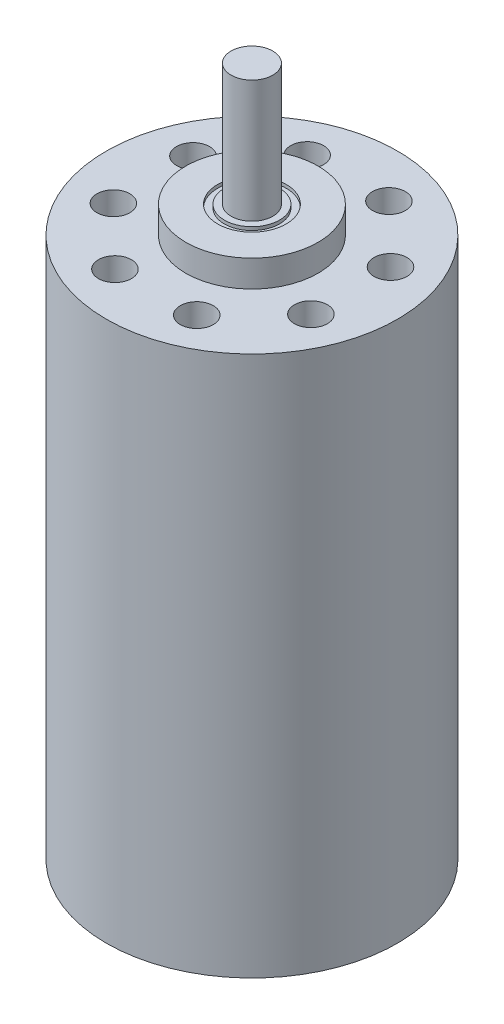
ISO-10303-21;
HEADER;
FILE_DESCRIPTION(('STEP AP214'),'2;1');
FILE_NAME('part.step','',(''),(''),'','','');
FILE_SCHEMA(('AUTOMOTIVE_DESIGN { 1 0 10303 214 1 1 1 1 }'));
ENDSEC;
DATA;
#1=APPLICATION_CONTEXT('core data for automotive mechanical design processes');
#2=APPLICATION_PROTOCOL_DEFINITION('international standard','automotive_design',2000,#1);
#3=PRODUCT_CONTEXT('',#1,'mechanical');
#4=PRODUCT('Part','Part','',(#3));
#5=PRODUCT_RELATED_PRODUCT_CATEGORY('part','',(#4));
#6=PRODUCT_DEFINITION_FORMATION('','',#4);
#7=PRODUCT_DEFINITION_CONTEXT('part definition',#1,'design');
#8=PRODUCT_DEFINITION('design','',#6,#7);
#9=PRODUCT_DEFINITION_SHAPE('','',#8);
#10=(LENGTH_UNIT() NAMED_UNIT(*) SI_UNIT(.MILLI.,.METRE.));
#11=(NAMED_UNIT(*) PLANE_ANGLE_UNIT() SI_UNIT($,.RADIAN.));
#12=(NAMED_UNIT(*) SI_UNIT($,.STERADIAN.) SOLID_ANGLE_UNIT());
#13=UNCERTAINTY_MEASURE_WITH_UNIT(LENGTH_MEASURE(1.E-05),#10,'distance_accuracy_value','');
#14=(GEOMETRIC_REPRESENTATION_CONTEXT(3) GLOBAL_UNCERTAINTY_ASSIGNED_CONTEXT((#13)) GLOBAL_UNIT_ASSIGNED_CONTEXT((#10,
#11,#12)) REPRESENTATION_CONTEXT('',''));
#15=CARTESIAN_POINT('',(0.,0.,0.));
#16=DIRECTION('',(0.,0.,1.));
#17=DIRECTION('',(1.,0.,0.));
#18=AXIS2_PLACEMENT_3D('',#15,#16,#17);
#19=CARTESIAN_POINT('',(0.,43.0276,0.));
#20=DIRECTION('',(0.,1.,0.));
#21=DIRECTION('',(0.,0.,1.));
#22=AXIS2_PLACEMENT_3D('',#19,#20,#21);
#23=PLANE('',#22);
#24=CARTESIAN_POINT('',(0.,43.0276,0.));
#25=DIRECTION('',(0.,1.,0.));
#26=DIRECTION('',(0.,0.,1.));
#27=AXIS2_PLACEMENT_3D('',#24,#25,#26);
#28=CIRCLE('',#27,2.601);
#29=CARTESIAN_POINT('',(0.,43.0276,2.601));
#30=VERTEX_POINT('',#29);
#31=EDGE_CURVE('E106',#30,#30,#28,.T.);
#32=ORIENTED_EDGE('',*,*,#31,.F.);
#33=EDGE_LOOP('',(#32));
#34=FACE_BOUND('',#33,.T.);
#35=CARTESIAN_POINT('',(0.,43.0276,0.));
#36=DIRECTION('',(0.,1.,0.));
#37=DIRECTION('',(0.,0.,1.));
#38=AXIS2_PLACEMENT_3D('',#35,#36,#37);
#39=CIRCLE('',#38,5.0165);
#40=CARTESIAN_POINT('',(0.,43.0276,5.0165));
#41=VERTEX_POINT('',#40);
#42=EDGE_CURVE('E44',#41,#41,#39,.T.);
#43=ORIENTED_EDGE('',*,*,#42,.T.);
#44=EDGE_LOOP('',(#43));
#45=FACE_BOUND('',#44,.T.);
#46=ADVANCED_FACE('F33',(#34,#45),#23,.T.);
#47=CARTESIAN_POINT('',(0.,40.9956,0.));
#48=DIRECTION('',(0.,1.,0.));
#49=DIRECTION('',(0.,0.,1.));
#50=AXIS2_PLACEMENT_3D('',#47,#48,#49);
#51=PLANE('',#50);
#52=CARTESIAN_POINT('',(-7.34834612172016,40.9956,3.16256371878895));
#53=DIRECTION('',(0.,1.,0.));
#54=DIRECTION('',(0.,0.,1.));
#55=AXIS2_PLACEMENT_3D('',#52,#53,#54);
#56=CIRCLE('',#55,1.25);
#57=CARTESIAN_POINT('',(-7.34834612172016,40.9956,4.41256371878895));
#58=VERTEX_POINT('',#57);
#59=EDGE_CURVE('E100',#58,#58,#56,.T.);
#60=ORIENTED_EDGE('',*,*,#59,.F.);
#61=EDGE_LOOP('',(#60));
#62=FACE_BOUND('',#61,.T.);
#63=CARTESIAN_POINT('',(-2.95979512168399,40.9956,7.43233562466441));
#64=DIRECTION('',(0.,1.,0.));
#65=DIRECTION('',(0.,0.,1.));
#66=AXIS2_PLACEMENT_3D('',#63,#64,#65);
#67=CIRCLE('',#66,1.25);
#68=CARTESIAN_POINT('',(-2.95979512168399,40.9956,8.68233562466441));
#69=VERTEX_POINT('',#68);
#70=EDGE_CURVE('E94',#69,#69,#67,.T.);
#71=ORIENTED_EDGE('',*,*,#70,.F.);
#72=EDGE_LOOP('',(#71));
#73=FACE_BOUND('',#72,.T.);
#74=CARTESIAN_POINT('',(3.16256371878895,40.9956,7.34834612172017));
#75=DIRECTION('',(0.,1.,0.));
#76=DIRECTION('',(0.,0.,1.));
#77=AXIS2_PLACEMENT_3D('',#74,#75,#76);
#78=CIRCLE('',#77,1.25);
#79=CARTESIAN_POINT('',(3.16256371878895,40.9956,8.59834612172017));
#80=VERTEX_POINT('',#79);
#81=EDGE_CURVE('E88',#80,#80,#78,.T.);
#82=ORIENTED_EDGE('',*,*,#81,.F.);
#83=EDGE_LOOP('',(#82));
#84=FACE_BOUND('',#83,.T.);
#85=CARTESIAN_POINT('',(7.43233562466441,40.9956,2.95979512168399));
#86=DIRECTION('',(0.,1.,0.));
#87=DIRECTION('',(0.,0.,1.));
#88=AXIS2_PLACEMENT_3D('',#85,#86,#87);
#89=CIRCLE('',#88,1.25);
#90=CARTESIAN_POINT('',(7.43233562466441,40.9956,4.20979512168399));
#91=VERTEX_POINT('',#90);
#92=EDGE_CURVE('E82',#91,#91,#89,.T.);
#93=ORIENTED_EDGE('',*,*,#92,.F.);
#94=EDGE_LOOP('',(#93));
#95=FACE_BOUND('',#94,.T.);
#96=CARTESIAN_POINT('',(7.34834612172017,40.9956,-3.16256371878894));
#97=DIRECTION('',(0.,1.,0.));
#98=DIRECTION('',(0.,0.,1.));
#99=AXIS2_PLACEMENT_3D('',#96,#97,#98);
#100=CIRCLE('',#99,1.25);
#101=CARTESIAN_POINT('',(7.34834612172017,40.9956,-1.91256371878894));
#102=VERTEX_POINT('',#101);
#103=EDGE_CURVE('E76',#102,#102,#100,.T.);
#104=ORIENTED_EDGE('',*,*,#103,.F.);
#105=EDGE_LOOP('',(#104));
#106=FACE_BOUND('',#105,.T.);
#107=CARTESIAN_POINT('',(2.95979512168399,40.9956,-7.43233562466441));
#108=DIRECTION('',(0.,1.,0.));
#109=DIRECTION('',(0.,0.,1.));
#110=AXIS2_PLACEMENT_3D('',#107,#108,#109);
#111=CIRCLE('',#110,1.25);
#112=CARTESIAN_POINT('',(2.95979512168399,40.9956,-6.18233562466441));
#113=VERTEX_POINT('',#112);
#114=EDGE_CURVE('E70',#113,#113,#111,.T.);
#115=ORIENTED_EDGE('',*,*,#114,.F.);
#116=EDGE_LOOP('',(#115));
#117=FACE_BOUND('',#116,.T.);
#118=CARTESIAN_POINT('',(-3.16256371878894,40.9956,-7.34834612172017));
#119=DIRECTION('',(0.,1.,0.));
#120=DIRECTION('',(0.,0.,1.));
#121=AXIS2_PLACEMENT_3D('',#118,#119,#120);
#122=CIRCLE('',#121,1.25);
#123=CARTESIAN_POINT('',(-3.16256371878894,40.9956,-6.09834612172017));
#124=VERTEX_POINT('',#123);
#125=EDGE_CURVE('E64',#124,#124,#122,.T.);
#126=ORIENTED_EDGE('',*,*,#125,.F.);
#127=EDGE_LOOP('',(#126));
#128=FACE_BOUND('',#127,.T.);
#129=CARTESIAN_POINT('',(-7.4323356246644,40.9956,-2.95979512168399));
#130=DIRECTION('',(0.,1.,0.));
#131=DIRECTION('',(0.,0.,1.));
#132=AXIS2_PLACEMENT_3D('',#129,#130,#131);
#133=CIRCLE('',#132,1.25);
#134=CARTESIAN_POINT('',(-7.4323356246644,40.9956,-1.70979512168399));
#135=VERTEX_POINT('',#134);
#136=EDGE_CURVE('E58',#135,#135,#133,.T.);
#137=ORIENTED_EDGE('',*,*,#136,.F.);
#138=EDGE_LOOP('',(#137));
#139=FACE_BOUND('',#138,.T.);
#140=CARTESIAN_POINT('',(0.,40.9956,0.));
#141=DIRECTION('',(0.,1.,0.));
#142=DIRECTION('',(0.,0.,1.));
#143=AXIS2_PLACEMENT_3D('',#140,#141,#142);
#144=CIRCLE('',#143,11.049);
#145=CARTESIAN_POINT('',(0.,40.9956,11.049));
#146=VERTEX_POINT('',#145);
#147=EDGE_CURVE('E10',#146,#146,#144,.T.);
#148=ORIENTED_EDGE('',*,*,#147,.T.);
#149=EDGE_LOOP('',(#148));
#150=FACE_BOUND('',#149,.T.);
#151=CARTESIAN_POINT('',(0.,40.9956,0.));
#152=DIRECTION('',(0.,1.,0.));
#153=DIRECTION('',(0.,0.,1.));
#154=AXIS2_PLACEMENT_3D('',#151,#152,#153);
#155=CIRCLE('',#154,5.0165);
#156=CARTESIAN_POINT('',(0.,40.9956,5.0165));
#157=VERTEX_POINT('',#156);
#158=EDGE_CURVE('E46',#157,#157,#155,.T.);
#159=ORIENTED_EDGE('',*,*,#158,.F.);
#160=EDGE_LOOP('',(#159));
#161=FACE_BOUND('',#160,.T.);
#162=ADVANCED_FACE('F136',(#62,#73,#84,#95,#106,#117,#128,#139,#150,#161),#51,.T.);
#163=CARTESIAN_POINT('',(0.,40.9956,0.));
#164=DIRECTION('',(0.,-1.,0.));
#165=DIRECTION('',(0.,0.,-1.));
#166=AXIS2_PLACEMENT_3D('',#163,#164,#165);
#167=CYLINDRICAL_SURFACE('',#166,11.049);
#168=ORIENTED_EDGE('',*,*,#147,.F.);
#169=EDGE_LOOP('',(#168));
#170=FACE_BOUND('',#169,.T.);
#171=CARTESIAN_POINT('',(0.,0.,0.));
#172=DIRECTION('',(0.,1.,0.));
#173=DIRECTION('',(0.,0.,1.));
#174=AXIS2_PLACEMENT_3D('',#171,#172,#173);
#175=CIRCLE('',#174,11.049);
#176=CARTESIAN_POINT('',(0.,0.,11.049));
#177=VERTEX_POINT('',#176);
#178=EDGE_CURVE('E37',#177,#177,#175,.T.);
#179=ORIENTED_EDGE('',*,*,#178,.T.);
#180=EDGE_LOOP('',(#179));
#181=FACE_BOUND('',#180,.T.);
#182=ADVANCED_FACE('F35',(#170,#181),#167,.T.);
#183=CARTESIAN_POINT('',(0.,0.,0.));
#184=DIRECTION('',(0.,1.,0.));
#185=DIRECTION('',(0.,0.,1.));
#186=AXIS2_PLACEMENT_3D('',#183,#184,#185);
#187=PLANE('',#186);
#188=ORIENTED_EDGE('',*,*,#178,.F.);
#189=EDGE_LOOP('',(#188));
#190=FACE_BOUND('',#189,.T.);
#191=ADVANCED_FACE('F145',(#190),#187,.F.);
#192=CARTESIAN_POINT('',(0.,43.0276,0.));
#193=DIRECTION('',(0.,-1.,0.));
#194=DIRECTION('',(0.,0.,-1.));
#195=AXIS2_PLACEMENT_3D('',#192,#193,#194);
#196=CYLINDRICAL_SURFACE('',#195,5.0165);
#197=ORIENTED_EDGE('',*,*,#42,.F.);
#198=EDGE_LOOP('',(#197));
#199=FACE_BOUND('',#198,.T.);
#200=ORIENTED_EDGE('',*,*,#158,.T.);
#201=EDGE_LOOP('',(#200));
#202=FACE_BOUND('',#201,.T.);
#203=ADVANCED_FACE('F141',(#199,#202),#196,.T.);
#204=CARTESIAN_POINT('',(-7.4323356246644,37.8206,-2.95979512168399));
#205=DIRECTION('',(0.,1.,0.));
#206=DIRECTION('',(0.,0.,1.));
#207=AXIS2_PLACEMENT_3D('',#204,#205,#206);
#208=CYLINDRICAL_SURFACE('',#207,1.25);
#209=CARTESIAN_POINT('',(-7.4323356246644,37.8206,-2.95979512168399));
#210=DIRECTION('',(0.,1.,0.));
#211=DIRECTION('',(0.,0.,1.));
#212=AXIS2_PLACEMENT_3D('',#209,#210,#211);
#213=CIRCLE('',#212,1.25);
#214=CARTESIAN_POINT('',(-7.4323356246644,37.8206,-1.70979512168399));
#215=VERTEX_POINT('',#214);
#216=EDGE_CURVE('E55',#215,#215,#213,.T.);
#217=ORIENTED_EDGE('',*,*,#216,.F.);
#218=EDGE_LOOP('',(#217));
#219=FACE_BOUND('',#218,.T.);
#220=ORIENTED_EDGE('',*,*,#136,.T.);
#221=EDGE_LOOP('',(#220));
#222=FACE_BOUND('',#221,.T.);
#223=ADVANCED_FACE('F144',(#219,#222),#208,.F.);
#224=CARTESIAN_POINT('',(-7.4323356246644,37.8206,-2.95979512168399));
#225=DIRECTION('',(0.,1.,0.));
#226=DIRECTION('',(0.,0.,1.));
#227=AXIS2_PLACEMENT_3D('',#224,#225,#226);
#228=PLANE('',#227);
#229=ORIENTED_EDGE('',*,*,#216,.T.);
#230=EDGE_LOOP('',(#229));
#231=FACE_BOUND('',#230,.T.);
#232=ADVANCED_FACE('F178',(#231),#228,.T.);
#233=CARTESIAN_POINT('',(-3.16256371878894,37.8206,-7.34834612172017));
#234=DIRECTION('',(0.,1.,0.));
#235=DIRECTION('',(0.,0.,1.));
#236=AXIS2_PLACEMENT_3D('',#233,#234,#235);
#237=CYLINDRICAL_SURFACE('',#236,1.25);
#238=CARTESIAN_POINT('',(-3.16256371878894,37.8206,-7.34834612172017));
#239=DIRECTION('',(0.,1.,0.));
#240=DIRECTION('',(0.,0.,1.));
#241=AXIS2_PLACEMENT_3D('',#238,#239,#240);
#242=CIRCLE('',#241,1.25);
#243=CARTESIAN_POINT('',(-3.16256371878894,37.8206,-6.09834612172017));
#244=VERTEX_POINT('',#243);
#245=EDGE_CURVE('E61',#244,#244,#242,.T.);
#246=ORIENTED_EDGE('',*,*,#245,.F.);
#247=EDGE_LOOP('',(#246));
#248=FACE_BOUND('',#247,.T.);
#249=ORIENTED_EDGE('',*,*,#125,.T.);
#250=EDGE_LOOP('',(#249));
#251=FACE_BOUND('',#250,.T.);
#252=ADVANCED_FACE('F188',(#248,#251),#237,.F.);
#253=CARTESIAN_POINT('',(-3.16256371878894,37.8206,-7.34834612172017));
#254=DIRECTION('',(0.,1.,0.));
#255=DIRECTION('',(0.,0.,1.));
#256=AXIS2_PLACEMENT_3D('',#253,#254,#255);
#257=PLANE('',#256);
#258=ORIENTED_EDGE('',*,*,#245,.T.);
#259=EDGE_LOOP('',(#258));
#260=FACE_BOUND('',#259,.T.);
#261=ADVANCED_FACE('F196',(#260),#257,.T.);
#262=CARTESIAN_POINT('',(2.95979512168399,37.8206,-7.43233562466441));
#263=DIRECTION('',(0.,1.,0.));
#264=DIRECTION('',(0.,0.,1.));
#265=AXIS2_PLACEMENT_3D('',#262,#263,#264);
#266=CYLINDRICAL_SURFACE('',#265,1.25);
#267=CARTESIAN_POINT('',(2.95979512168399,37.8206,-7.43233562466441));
#268=DIRECTION('',(0.,1.,0.));
#269=DIRECTION('',(0.,0.,1.));
#270=AXIS2_PLACEMENT_3D('',#267,#268,#269);
#271=CIRCLE('',#270,1.25);
#272=CARTESIAN_POINT('',(2.95979512168399,37.8206,-6.18233562466441));
#273=VERTEX_POINT('',#272);
#274=EDGE_CURVE('E67',#273,#273,#271,.T.);
#275=ORIENTED_EDGE('',*,*,#274,.F.);
#276=EDGE_LOOP('',(#275));
#277=FACE_BOUND('',#276,.T.);
#278=ORIENTED_EDGE('',*,*,#114,.T.);
#279=EDGE_LOOP('',(#278));
#280=FACE_BOUND('',#279,.T.);
#281=ADVANCED_FACE('F204',(#277,#280),#266,.F.);
#282=CARTESIAN_POINT('',(2.95979512168399,37.8206,-7.43233562466441));
#283=DIRECTION('',(0.,1.,0.));
#284=DIRECTION('',(0.,0.,1.));
#285=AXIS2_PLACEMENT_3D('',#282,#283,#284);
#286=PLANE('',#285);
#287=ORIENTED_EDGE('',*,*,#274,.T.);
#288=EDGE_LOOP('',(#287));
#289=FACE_BOUND('',#288,.T.);
#290=ADVANCED_FACE('F212',(#289),#286,.T.);
#291=CARTESIAN_POINT('',(7.34834612172017,37.8206,-3.16256371878894));
#292=DIRECTION('',(0.,1.,0.));
#293=DIRECTION('',(0.,0.,1.));
#294=AXIS2_PLACEMENT_3D('',#291,#292,#293);
#295=CYLINDRICAL_SURFACE('',#294,1.25);
#296=CARTESIAN_POINT('',(7.34834612172017,37.8206,-3.16256371878894));
#297=DIRECTION('',(0.,1.,0.));
#298=DIRECTION('',(0.,0.,1.));
#299=AXIS2_PLACEMENT_3D('',#296,#297,#298);
#300=CIRCLE('',#299,1.25);
#301=CARTESIAN_POINT('',(7.34834612172017,37.8206,-1.91256371878894));
#302=VERTEX_POINT('',#301);
#303=EDGE_CURVE('E73',#302,#302,#300,.T.);
#304=ORIENTED_EDGE('',*,*,#303,.F.);
#305=EDGE_LOOP('',(#304));
#306=FACE_BOUND('',#305,.T.);
#307=ORIENTED_EDGE('',*,*,#103,.T.);
#308=EDGE_LOOP('',(#307));
#309=FACE_BOUND('',#308,.T.);
#310=ADVANCED_FACE('F220',(#306,#309),#295,.F.);
#311=CARTESIAN_POINT('',(7.34834612172017,37.8206,-3.16256371878894));
#312=DIRECTION('',(0.,1.,0.));
#313=DIRECTION('',(0.,0.,1.));
#314=AXIS2_PLACEMENT_3D('',#311,#312,#313);
#315=PLANE('',#314);
#316=ORIENTED_EDGE('',*,*,#303,.T.);
#317=EDGE_LOOP('',(#316));
#318=FACE_BOUND('',#317,.T.);
#319=ADVANCED_FACE('F229',(#318),#315,.T.);
#320=CARTESIAN_POINT('',(7.43233562466441,37.8206,2.95979512168399));
#321=DIRECTION('',(0.,1.,0.));
#322=DIRECTION('',(0.,0.,1.));
#323=AXIS2_PLACEMENT_3D('',#320,#321,#322);
#324=CYLINDRICAL_SURFACE('',#323,1.25);
#325=CARTESIAN_POINT('',(7.43233562466441,37.8206,2.95979512168399));
#326=DIRECTION('',(0.,1.,0.));
#327=DIRECTION('',(0.,0.,1.));
#328=AXIS2_PLACEMENT_3D('',#325,#326,#327);
#329=CIRCLE('',#328,1.25);
#330=CARTESIAN_POINT('',(7.43233562466441,37.8206,4.20979512168399));
#331=VERTEX_POINT('',#330);
#332=EDGE_CURVE('E79',#331,#331,#329,.T.);
#333=ORIENTED_EDGE('',*,*,#332,.F.);
#334=EDGE_LOOP('',(#333));
#335=FACE_BOUND('',#334,.T.);
#336=ORIENTED_EDGE('',*,*,#92,.T.);
#337=EDGE_LOOP('',(#336));
#338=FACE_BOUND('',#337,.T.);
#339=ADVANCED_FACE('F237',(#335,#338),#324,.F.);
#340=CARTESIAN_POINT('',(7.43233562466441,37.8206,2.95979512168399));
#341=DIRECTION('',(0.,1.,0.));
#342=DIRECTION('',(0.,0.,1.));
#343=AXIS2_PLACEMENT_3D('',#340,#341,#342);
#344=PLANE('',#343);
#345=ORIENTED_EDGE('',*,*,#332,.T.);
#346=EDGE_LOOP('',(#345));
#347=FACE_BOUND('',#346,.T.);
#348=ADVANCED_FACE('F245',(#347),#344,.T.);
#349=CARTESIAN_POINT('',(3.16256371878895,37.8206,7.34834612172017));
#350=DIRECTION('',(0.,1.,0.));
#351=DIRECTION('',(0.,0.,1.));
#352=AXIS2_PLACEMENT_3D('',#349,#350,#351);
#353=CYLINDRICAL_SURFACE('',#352,1.25);
#354=CARTESIAN_POINT('',(3.16256371878895,37.8206,7.34834612172017));
#355=DIRECTION('',(0.,1.,0.));
#356=DIRECTION('',(0.,0.,1.));
#357=AXIS2_PLACEMENT_3D('',#354,#355,#356);
#358=CIRCLE('',#357,1.25);
#359=CARTESIAN_POINT('',(3.16256371878895,37.8206,8.59834612172017));
#360=VERTEX_POINT('',#359);
#361=EDGE_CURVE('E85',#360,#360,#358,.T.);
#362=ORIENTED_EDGE('',*,*,#361,.F.);
#363=EDGE_LOOP('',(#362));
#364=FACE_BOUND('',#363,.T.);
#365=ORIENTED_EDGE('',*,*,#81,.T.);
#366=EDGE_LOOP('',(#365));
#367=FACE_BOUND('',#366,.T.);
#368=ADVANCED_FACE('F253',(#364,#367),#353,.F.);
#369=CARTESIAN_POINT('',(3.16256371878895,37.8206,7.34834612172017));
#370=DIRECTION('',(0.,1.,0.));
#371=DIRECTION('',(0.,0.,1.));
#372=AXIS2_PLACEMENT_3D('',#369,#370,#371);
#373=PLANE('',#372);
#374=ORIENTED_EDGE('',*,*,#361,.T.);
#375=EDGE_LOOP('',(#374));
#376=FACE_BOUND('',#375,.T.);
#377=ADVANCED_FACE('F261',(#376),#373,.T.);
#378=CARTESIAN_POINT('',(-2.95979512168399,37.8206,7.43233562466441));
#379=DIRECTION('',(0.,1.,0.));
#380=DIRECTION('',(0.,0.,1.));
#381=AXIS2_PLACEMENT_3D('',#378,#379,#380);
#382=CYLINDRICAL_SURFACE('',#381,1.25);
#383=CARTESIAN_POINT('',(-2.95979512168399,37.8206,7.43233562466441));
#384=DIRECTION('',(0.,1.,0.));
#385=DIRECTION('',(0.,0.,1.));
#386=AXIS2_PLACEMENT_3D('',#383,#384,#385);
#387=CIRCLE('',#386,1.25);
#388=CARTESIAN_POINT('',(-2.95979512168399,37.8206,8.68233562466441));
#389=VERTEX_POINT('',#388);
#390=EDGE_CURVE('E91',#389,#389,#387,.T.);
#391=ORIENTED_EDGE('',*,*,#390,.F.);
#392=EDGE_LOOP('',(#391));
#393=FACE_BOUND('',#392,.T.);
#394=ORIENTED_EDGE('',*,*,#70,.T.);
#395=EDGE_LOOP('',(#394));
#396=FACE_BOUND('',#395,.T.);
#397=ADVANCED_FACE('F269',(#393,#396),#382,.F.);
#398=CARTESIAN_POINT('',(-2.95979512168399,37.8206,7.43233562466441));
#399=DIRECTION('',(0.,1.,0.));
#400=DIRECTION('',(0.,0.,1.));
#401=AXIS2_PLACEMENT_3D('',#398,#399,#400);
#402=PLANE('',#401);
#403=ORIENTED_EDGE('',*,*,#390,.T.);
#404=EDGE_LOOP('',(#403));
#405=FACE_BOUND('',#404,.T.);
#406=ADVANCED_FACE('F277',(#405),#402,.T.);
#407=CARTESIAN_POINT('',(-7.34834612172016,37.8206,3.16256371878895));
#408=DIRECTION('',(0.,1.,0.));
#409=DIRECTION('',(0.,0.,1.));
#410=AXIS2_PLACEMENT_3D('',#407,#408,#409);
#411=CYLINDRICAL_SURFACE('',#410,1.25);
#412=CARTESIAN_POINT('',(-7.34834612172016,37.8206,3.16256371878895));
#413=DIRECTION('',(0.,1.,0.));
#414=DIRECTION('',(0.,0.,1.));
#415=AXIS2_PLACEMENT_3D('',#412,#413,#414);
#416=CIRCLE('',#415,1.25);
#417=CARTESIAN_POINT('',(-7.34834612172016,37.8206,4.41256371878895));
#418=VERTEX_POINT('',#417);
#419=EDGE_CURVE('E97',#418,#418,#416,.T.);
#420=ORIENTED_EDGE('',*,*,#419,.F.);
#421=EDGE_LOOP('',(#420));
#422=FACE_BOUND('',#421,.T.);
#423=ORIENTED_EDGE('',*,*,#59,.T.);
#424=EDGE_LOOP('',(#423));
#425=FACE_BOUND('',#424,.T.);
#426=ADVANCED_FACE('F284',(#422,#425),#411,.F.);
#427=CARTESIAN_POINT('',(-7.34834612172016,37.8206,3.16256371878895));
#428=DIRECTION('',(0.,1.,0.));
#429=DIRECTION('',(0.,0.,1.));
#430=AXIS2_PLACEMENT_3D('',#427,#428,#429);
#431=PLANE('',#430);
#432=ORIENTED_EDGE('',*,*,#419,.T.);
#433=EDGE_LOOP('',(#432));
#434=FACE_BOUND('',#433,.T.);
#435=ADVANCED_FACE('F130',(#434),#431,.T.);
#436=CARTESIAN_POINT('',(0.,42.7736,0.));
#437=DIRECTION('',(0.,1.,0.));
#438=DIRECTION('',(0.,0.,1.));
#439=AXIS2_PLACEMENT_3D('',#436,#437,#438);
#440=CYLINDRICAL_SURFACE('',#439,2.601);
#441=CARTESIAN_POINT('',(0.,42.7736,0.));
#442=DIRECTION('',(0.,1.,0.));
#443=DIRECTION('',(0.,0.,1.));
#444=AXIS2_PLACEMENT_3D('',#441,#442,#443);
#445=CIRCLE('',#444,2.601);
#446=CARTESIAN_POINT('',(0.,42.7736,2.601));
#447=VERTEX_POINT('',#446);
#448=EDGE_CURVE('E103',#447,#447,#445,.T.);
#449=ORIENTED_EDGE('',*,*,#448,.F.);
#450=EDGE_LOOP('',(#449));
#451=FACE_BOUND('',#450,.T.);
#452=ORIENTED_EDGE('',*,*,#31,.T.);
#453=EDGE_LOOP('',(#452));
#454=FACE_BOUND('',#453,.T.);
#455=ADVANCED_FACE('F124',(#451,#454),#440,.F.);
#456=CARTESIAN_POINT('',(0.,42.7736,0.));
#457=DIRECTION('',(0.,1.,0.));
#458=DIRECTION('',(0.,0.,1.));
#459=AXIS2_PLACEMENT_3D('',#456,#457,#458);
#460=PLANE('',#459);
#461=CARTESIAN_POINT('',(0.,42.7736,0.));
#462=DIRECTION('',(0.,1.,0.));
#463=DIRECTION('',(0.,0.,1.));
#464=AXIS2_PLACEMENT_3D('',#461,#462,#463);
#465=CIRCLE('',#464,2.093);
#466=CARTESIAN_POINT('',(0.,42.7736,2.093));
#467=VERTEX_POINT('',#466);
#468=EDGE_CURVE('E109',#467,#467,#465,.T.);
#469=ORIENTED_EDGE('',*,*,#468,.F.);
#470=EDGE_LOOP('',(#469));
#471=FACE_BOUND('',#470,.T.);
#472=ORIENTED_EDGE('',*,*,#448,.T.);
#473=EDGE_LOOP('',(#472));
#474=FACE_BOUND('',#473,.T.);
#475=ADVANCED_FACE('F121',(#471,#474),#460,.T.);
#476=CARTESIAN_POINT('',(0.,42.7736,0.));
#477=DIRECTION('',(0.,1.,0.));
#478=DIRECTION('',(0.,0.,1.));
#479=AXIS2_PLACEMENT_3D('',#476,#477,#478);
#480=CYLINDRICAL_SURFACE('',#479,2.093);
#481=ORIENTED_EDGE('',*,*,#468,.T.);
#482=EDGE_LOOP('',(#481));
#483=FACE_BOUND('',#482,.T.);
#484=CARTESIAN_POINT('',(0.,43.0276,0.));
#485=DIRECTION('',(0.,1.,0.));
#486=DIRECTION('',(0.,0.,1.));
#487=AXIS2_PLACEMENT_3D('',#484,#485,#486);
#488=CIRCLE('',#487,2.093);
#489=CARTESIAN_POINT('',(0.,43.0276,2.093));
#490=VERTEX_POINT('',#489);
#491=EDGE_CURVE('E112',#490,#490,#488,.T.);
#492=ORIENTED_EDGE('',*,*,#491,.F.);
#493=EDGE_LOOP('',(#492));
#494=FACE_BOUND('',#493,.T.);
#495=ADVANCED_FACE('F118',(#483,#494),#480,.T.);
#496=CARTESIAN_POINT('',(0.,52.2986,0.));
#497=DIRECTION('',(0.,1.,0.));
#498=DIRECTION('',(0.,0.,1.));
#499=AXIS2_PLACEMENT_3D('',#496,#497,#498);
#500=PLANE('',#499);
#501=CARTESIAN_POINT('',(0.,52.2986,0.));
#502=DIRECTION('',(0.,1.,0.));
#503=DIRECTION('',(0.,0.,1.));
#504=AXIS2_PLACEMENT_3D('',#501,#502,#503);
#505=CIRCLE('',#504,1.585);
#506=CARTESIAN_POINT('',(0.,52.2986,1.585));
#507=VERTEX_POINT('',#506);
#508=EDGE_CURVE('E49',#507,#507,#505,.T.);
#509=ORIENTED_EDGE('',*,*,#508,.T.);
#510=EDGE_LOOP('',(#509));
#511=FACE_BOUND('',#510,.T.);
#512=ADVANCED_FACE('F314',(#511),#500,.T.);
#513=CARTESIAN_POINT('',(0.,52.2986,0.));
#514=DIRECTION('',(0.,-1.,0.));
#515=DIRECTION('',(0.,0.,-1.));
#516=AXIS2_PLACEMENT_3D('',#513,#514,#515);
#517=CYLINDRICAL_SURFACE('',#516,1.585);
#518=ORIENTED_EDGE('',*,*,#508,.F.);
#519=EDGE_LOOP('',(#518));
#520=FACE_BOUND('',#519,.T.);
#521=CARTESIAN_POINT('',(0.,43.0276,0.));
#522=DIRECTION('',(0.,1.,0.));
#523=DIRECTION('',(0.,0.,1.));
#524=AXIS2_PLACEMENT_3D('',#521,#522,#523);
#525=CIRCLE('',#524,1.585);
#526=CARTESIAN_POINT('',(0.,43.0276,1.585));
#527=VERTEX_POINT('',#526);
#528=EDGE_CURVE('E52',#527,#527,#525,.T.);
#529=ORIENTED_EDGE('',*,*,#528,.T.);
#530=EDGE_LOOP('',(#529));
#531=FACE_BOUND('',#530,.T.);
#532=ADVANCED_FACE('F321',(#520,#531),#517,.T.);
#533=ORIENTED_EDGE('',*,*,#528,.F.);
#534=EDGE_LOOP('',(#533));
#535=FACE_BOUND('',#534,.T.);
#536=ORIENTED_EDGE('',*,*,#491,.T.);
#537=EDGE_LOOP('',(#536));
#538=FACE_BOUND('',#537,.T.);
#539=ADVANCED_FACE('F138',(#535,#538),#23,.T.);
#540=CLOSED_SHELL('',(#46,#162,#182,#191,#203,#223,#232,#252,#261,#281,#290,#310,#319,#339,#348,
#368,#377,#397,#406,#426,#435,#455,#475,#495,#512,#532,#539));
#541=MANIFOLD_SOLID_BREP('B2',#540);
#542=ADVANCED_BREP_SHAPE_REPRESENTATION('',(#18,#541),#14);
#543=SHAPE_DEFINITION_REPRESENTATION(#9,#542);
ENDSEC;
END-ISO-10303-21;
